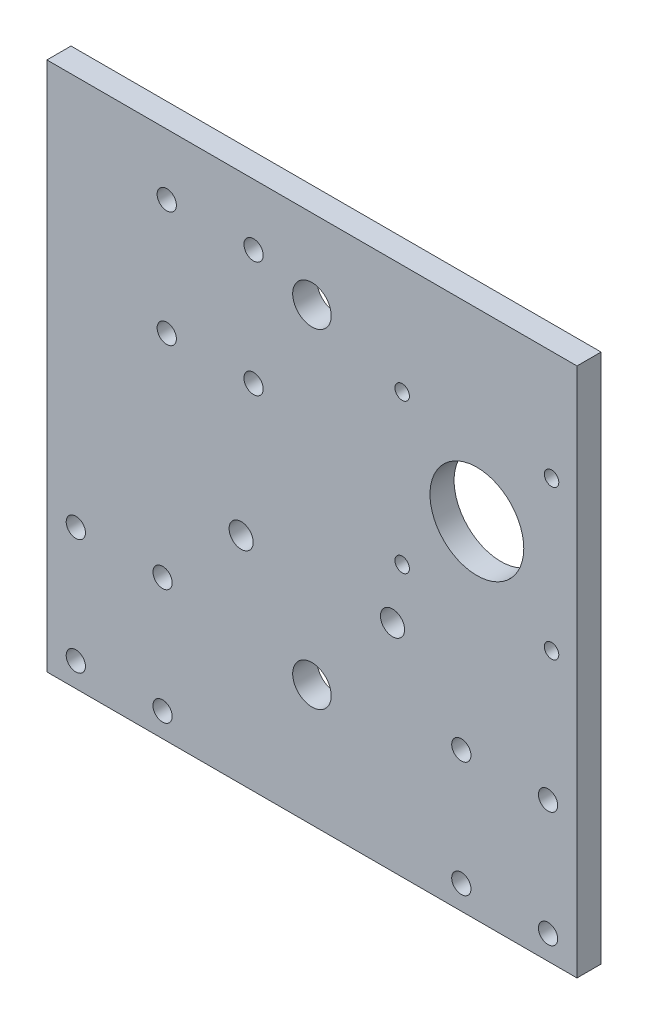
ISO-10303-21;
HEADER;
FILE_DESCRIPTION(('STEP AP214'),'2;1');
FILE_NAME('part.step','',(''),(''),'','','');
FILE_SCHEMA(('AUTOMOTIVE_DESIGN { 1 0 10303 214 1 1 1 1 }'));
ENDSEC;
DATA;
#1=APPLICATION_CONTEXT('core data for automotive mechanical design processes');
#2=APPLICATION_PROTOCOL_DEFINITION('international standard','automotive_design',2000,#1);
#3=PRODUCT_CONTEXT('',#1,'mechanical');
#4=PRODUCT('Part','Part','',(#3));
#5=PRODUCT_RELATED_PRODUCT_CATEGORY('part','',(#4));
#6=PRODUCT_DEFINITION_FORMATION('','',#4);
#7=PRODUCT_DEFINITION_CONTEXT('part definition',#1,'design');
#8=PRODUCT_DEFINITION('design','',#6,#7);
#9=PRODUCT_DEFINITION_SHAPE('','',#8);
#10=(LENGTH_UNIT() NAMED_UNIT(*) SI_UNIT(.MILLI.,.METRE.));
#11=(NAMED_UNIT(*) PLANE_ANGLE_UNIT() SI_UNIT($,.RADIAN.));
#12=(NAMED_UNIT(*) SI_UNIT($,.STERADIAN.) SOLID_ANGLE_UNIT());
#13=UNCERTAINTY_MEASURE_WITH_UNIT(LENGTH_MEASURE(1.E-05),#10,'distance_accuracy_value','');
#14=(GEOMETRIC_REPRESENTATION_CONTEXT(3) GLOBAL_UNCERTAINTY_ASSIGNED_CONTEXT((#13)) GLOBAL_UNIT_ASSIGNED_CONTEXT((#10,
#11,#12)) REPRESENTATION_CONTEXT('',''));
#15=CARTESIAN_POINT('',(0.,0.,0.));
#16=DIRECTION('',(0.,0.,1.));
#17=DIRECTION('',(1.,0.,0.));
#18=AXIS2_PLACEMENT_3D('',#15,#16,#17);
#19=CARTESIAN_POINT('',(0.,0.,5.));
#20=DIRECTION('',(0.,0.,1.));
#21=DIRECTION('',(1.,0.,0.));
#22=AXIS2_PLACEMENT_3D('',#19,#20,#21);
#23=PLANE('',#22);
#24=CARTESIAN_POINT('',(-12.1170545369142,10.9400694331961,5.));
#25=DIRECTION('',(0.,0.,1.));
#26=DIRECTION('',(1.,0.,0.));
#27=AXIS2_PLACEMENT_3D('',#24,#25,#26);
#28=CIRCLE('',#27,2.00000000000001);
#29=CARTESIAN_POINT('',(-10.1170545369142,10.9400694331961,5.));
#30=VERTEX_POINT('',#29);
#31=EDGE_CURVE('E223',#30,#30,#28,.T.);
#32=ORIENTED_EDGE('',*,*,#31,.F.);
#33=EDGE_LOOP('',(#32));
#34=FACE_BOUND('',#33,.T.);
#35=CARTESIAN_POINT('',(-30.130204967949,34.9576033412424,5.));
#36=DIRECTION('',(0.,0.,1.));
#37=DIRECTION('',(1.,0.,0.));
#38=AXIS2_PLACEMENT_3D('',#35,#36,#37);
#39=CIRCLE('',#38,2.);
#40=CARTESIAN_POINT('',(-28.130204967949,34.9576033412424,5.));
#41=VERTEX_POINT('',#40);
#42=EDGE_CURVE('E211',#41,#41,#39,.T.);
#43=ORIENTED_EDGE('',*,*,#42,.F.);
#44=EDGE_LOOP('',(#43));
#45=FACE_BOUND('',#44,.T.);
#46=CARTESIAN_POINT('',(-14.6929836231473,-17.6563688298987,5.));
#47=DIRECTION('',(0.,0.,1.));
#48=DIRECTION('',(1.,0.,0.));
#49=AXIS2_PLACEMENT_3D('',#46,#47,#48);
#50=CIRCLE('',#49,2.5);
#51=CARTESIAN_POINT('',(-12.1929836231473,-17.6563688298987,5.));
#52=VERTEX_POINT('',#51);
#53=EDGE_CURVE('E199',#52,#52,#50,.T.);
#54=ORIENTED_EDGE('',*,*,#53,.F.);
#55=EDGE_LOOP('',(#54));
#56=FACE_BOUND('',#55,.T.);
#57=CARTESIAN_POINT('',(0.,31.1488363872192,5.));
#58=DIRECTION('',(0.,0.,1.));
#59=DIRECTION('',(1.,0.,0.));
#60=AXIS2_PLACEMENT_3D('',#57,#58,#59);
#61=CIRCLE('',#60,4.00000000000001);
#62=CARTESIAN_POINT('',(4.00000000000001,31.1488363872192,5.));
#63=VERTEX_POINT('',#62);
#64=EDGE_CURVE('E187',#63,#63,#61,.T.);
#65=ORIENTED_EDGE('',*,*,#64,.F.);
#66=EDGE_LOOP('',(#65));
#67=FACE_BOUND('',#66,.T.);
#68=CARTESIAN_POINT('',(18.7257473028765,-6.17122300485301,5.));
#69=DIRECTION('',(0.,0.,1.));
#70=DIRECTION('',(1.,0.,0.));
#71=AXIS2_PLACEMENT_3D('',#68,#69,#70);
#72=CIRCLE('',#71,1.5);
#73=CARTESIAN_POINT('',(20.2257473028765,-6.17122300485301,5.));
#74=VERTEX_POINT('',#73);
#75=EDGE_CURVE('E175',#74,#74,#72,.T.);
#76=ORIENTED_EDGE('',*,*,#75,.F.);
#77=EDGE_LOOP('',(#76));
#78=FACE_BOUND('',#77,.T.);
#79=CARTESIAN_POINT('',(49.7257473028764,24.828776995147,5.));
#80=DIRECTION('',(0.,0.,1.));
#81=DIRECTION('',(1.,0.,0.));
#82=AXIS2_PLACEMENT_3D('',#79,#80,#81);
#83=CIRCLE('',#82,1.50000000000002);
#84=CARTESIAN_POINT('',(51.2257473028765,24.828776995147,5.));
#85=VERTEX_POINT('',#84);
#86=EDGE_CURVE('E163',#85,#85,#83,.T.);
#87=ORIENTED_EDGE('',*,*,#86,.F.);
#88=EDGE_LOOP('',(#87));
#89=FACE_BOUND('',#88,.T.);
#90=CARTESIAN_POINT('',(49.,-57.3511636127808,5.));
#91=DIRECTION('',(0.,0.,1.));
#92=DIRECTION('',(1.,0.,0.));
#93=AXIS2_PLACEMENT_3D('',#90,#91,#92);
#94=CIRCLE('',#93,2.);
#95=CARTESIAN_POINT('',(51.,-57.3511636127808,5.));
#96=VERTEX_POINT('',#95);
#97=EDGE_CURVE('E151',#96,#96,#94,.T.);
#98=ORIENTED_EDGE('',*,*,#97,.F.);
#99=EDGE_LOOP('',(#98));
#100=FACE_BOUND('',#99,.T.);
#101=CARTESIAN_POINT('',(-31.,-57.3511636127808,5.));
#102=DIRECTION('',(0.,0.,1.));
#103=DIRECTION('',(1.,0.,0.));
#104=AXIS2_PLACEMENT_3D('',#101,#102,#103);
#105=CIRCLE('',#104,2.);
#106=CARTESIAN_POINT('',(-29.,-57.3511636127808,5.));
#107=VERTEX_POINT('',#106);
#108=EDGE_CURVE('E139',#107,#107,#105,.T.);
#109=ORIENTED_EDGE('',*,*,#108,.F.);
#110=EDGE_LOOP('',(#109));
#111=FACE_BOUND('',#110,.T.);
#112=CARTESIAN_POINT('',(-49.,-33.3511636127808,5.));
#113=DIRECTION('',(0.,0.,1.));
#114=DIRECTION('',(1.,0.,0.));
#115=AXIS2_PLACEMENT_3D('',#112,#113,#114);
#116=CIRCLE('',#115,2.);
#117=CARTESIAN_POINT('',(-47.,-33.3511636127808,5.));
#118=VERTEX_POINT('',#117);
#119=EDGE_CURVE('E127',#118,#118,#116,.T.);
#120=ORIENTED_EDGE('',*,*,#119,.F.);
#121=EDGE_LOOP('',(#120));
#122=FACE_BOUND('',#121,.T.);
#123=CARTESIAN_POINT('',(31.,-33.3511636127808,5.));
#124=DIRECTION('',(0.,0.,1.));
#125=DIRECTION('',(1.,0.,0.));
#126=AXIS2_PLACEMENT_3D('',#123,#124,#125);
#127=CIRCLE('',#126,2.);
#128=CARTESIAN_POINT('',(33.,-33.3511636127808,5.));
#129=VERTEX_POINT('',#128);
#130=EDGE_CURVE('E115',#129,#129,#127,.T.);
#131=ORIENTED_EDGE('',*,*,#130,.F.);
#132=EDGE_LOOP('',(#131));
#133=FACE_BOUND('',#132,.T.);
#134=DIRECTION('',(0.,1.,0.));
#135=VECTOR('',#134,1.);
#136=CARTESIAN_POINT('',(55.,47.6488363872192,5.));
#137=LINE('',#136,#135);
#138=CARTESIAN_POINT('',(55.,-62.3511636127808,5.));
#139=VERTEX_POINT('',#138);
#140=CARTESIAN_POINT('',(55.,47.6488363872192,5.));
#141=VERTEX_POINT('',#140);
#142=EDGE_CURVE('E85',#139,#141,#137,.T.);
#143=ORIENTED_EDGE('',*,*,#142,.T.);
#144=DIRECTION('',(-1.,0.,0.));
#145=VECTOR('',#144,1.);
#146=CARTESIAN_POINT('',(-55.,47.6488363872192,5.));
#147=LINE('',#146,#145);
#148=CARTESIAN_POINT('',(-55.,47.6488363872192,5.));
#149=VERTEX_POINT('',#148);
#150=EDGE_CURVE('E80',#141,#149,#147,.T.);
#151=ORIENTED_EDGE('',*,*,#150,.T.);
#152=DIRECTION('',(0.,-1.,0.));
#153=VECTOR('',#152,1.);
#154=CARTESIAN_POINT('',(-55.,47.6488363872192,5.));
#155=LINE('',#154,#153);
#156=CARTESIAN_POINT('',(-55.,-62.3511636127808,5.));
#157=VERTEX_POINT('',#156);
#158=EDGE_CURVE('E83',#149,#157,#155,.T.);
#159=ORIENTED_EDGE('',*,*,#158,.T.);
#160=DIRECTION('',(1.,0.,0.));
#161=VECTOR('',#160,1.);
#162=CARTESIAN_POINT('',(-55.,-62.3511636127808,5.));
#163=LINE('',#162,#161);
#164=EDGE_CURVE('E50',#157,#139,#163,.T.);
#165=ORIENTED_EDGE('',*,*,#164,.T.);
#166=EDGE_LOOP('',(#143,#151,#159,#165));
#167=FACE_BOUND('',#166,.T.);
#168=CARTESIAN_POINT('',(49.,-33.3511636127808,5.));
#169=DIRECTION('',(0.,0.,1.));
#170=DIRECTION('',(1.,0.,0.));
#171=AXIS2_PLACEMENT_3D('',#168,#169,#170);
#172=CIRCLE('',#171,2.);
#173=CARTESIAN_POINT('',(51.,-33.3511636127808,5.));
#174=VERTEX_POINT('',#173);
#175=EDGE_CURVE('E100',#174,#174,#172,.T.);
#176=ORIENTED_EDGE('',*,*,#175,.F.);
#177=EDGE_LOOP('',(#176));
#178=FACE_BOUND('',#177,.T.);
#179=CARTESIAN_POINT('',(-31.,-33.3511636127808,5.));
#180=DIRECTION('',(0.,0.,1.));
#181=DIRECTION('',(1.,0.,0.));
#182=AXIS2_PLACEMENT_3D('',#179,#180,#181);
#183=CIRCLE('',#182,2.);
#184=CARTESIAN_POINT('',(-29.,-33.3511636127808,5.));
#185=VERTEX_POINT('',#184);
#186=EDGE_CURVE('E121',#185,#185,#183,.T.);
#187=ORIENTED_EDGE('',*,*,#186,.F.);
#188=EDGE_LOOP('',(#187));
#189=FACE_BOUND('',#188,.T.);
#190=CARTESIAN_POINT('',(-49.,-57.3511636127808,5.));
#191=DIRECTION('',(0.,0.,1.));
#192=DIRECTION('',(1.,0.,0.));
#193=AXIS2_PLACEMENT_3D('',#190,#191,#192);
#194=CIRCLE('',#193,2.);
#195=CARTESIAN_POINT('',(-47.,-57.3511636127808,5.));
#196=VERTEX_POINT('',#195);
#197=EDGE_CURVE('E133',#196,#196,#194,.T.);
#198=ORIENTED_EDGE('',*,*,#197,.F.);
#199=EDGE_LOOP('',(#198));
#200=FACE_BOUND('',#199,.T.);
#201=CARTESIAN_POINT('',(31.,-57.3511636127808,5.));
#202=DIRECTION('',(0.,0.,1.));
#203=DIRECTION('',(1.,0.,0.));
#204=AXIS2_PLACEMENT_3D('',#201,#202,#203);
#205=CIRCLE('',#204,2.);
#206=CARTESIAN_POINT('',(33.,-57.3511636127808,5.));
#207=VERTEX_POINT('',#206);
#208=EDGE_CURVE('E145',#207,#207,#205,.T.);
#209=ORIENTED_EDGE('',*,*,#208,.F.);
#210=EDGE_LOOP('',(#209));
#211=FACE_BOUND('',#210,.T.);
#212=CARTESIAN_POINT('',(34.2257473028765,9.32877699514699,5.));
#213=DIRECTION('',(0.,0.,1.));
#214=DIRECTION('',(1.,0.,0.));
#215=AXIS2_PLACEMENT_3D('',#212,#213,#214);
#216=CIRCLE('',#215,9.73080513096991);
#217=CARTESIAN_POINT('',(43.9565524338464,9.32877699514699,5.));
#218=VERTEX_POINT('',#217);
#219=EDGE_CURVE('E157',#218,#218,#216,.T.);
#220=ORIENTED_EDGE('',*,*,#219,.F.);
#221=EDGE_LOOP('',(#220));
#222=FACE_BOUND('',#221,.T.);
#223=CARTESIAN_POINT('',(49.7257473028765,-6.17122300485301,5.));
#224=DIRECTION('',(0.,0.,1.));
#225=DIRECTION('',(1.,0.,0.));
#226=AXIS2_PLACEMENT_3D('',#223,#224,#225);
#227=CIRCLE('',#226,1.50000000000001);
#228=CARTESIAN_POINT('',(51.2257473028765,-6.17122300485301,5.));
#229=VERTEX_POINT('',#228);
#230=EDGE_CURVE('E169',#229,#229,#227,.T.);
#231=ORIENTED_EDGE('',*,*,#230,.F.);
#232=EDGE_LOOP('',(#231));
#233=FACE_BOUND('',#232,.T.);
#234=CARTESIAN_POINT('',(18.7257473028765,24.828776995147,5.));
#235=DIRECTION('',(0.,0.,1.));
#236=DIRECTION('',(1.,0.,0.));
#237=AXIS2_PLACEMENT_3D('',#234,#235,#236);
#238=CIRCLE('',#237,1.5);
#239=CARTESIAN_POINT('',(20.2257473028765,24.828776995147,5.));
#240=VERTEX_POINT('',#239);
#241=EDGE_CURVE('E181',#240,#240,#238,.T.);
#242=ORIENTED_EDGE('',*,*,#241,.F.);
#243=EDGE_LOOP('',(#242));
#244=FACE_BOUND('',#243,.T.);
#245=CARTESIAN_POINT('',(0.,-37.1511636127808,5.));
#246=DIRECTION('',(0.,0.,1.));
#247=DIRECTION('',(1.,0.,0.));
#248=AXIS2_PLACEMENT_3D('',#245,#246,#247);
#249=CIRCLE('',#248,4.);
#250=CARTESIAN_POINT('',(4.,-37.1511636127808,5.));
#251=VERTEX_POINT('',#250);
#252=EDGE_CURVE('E193',#251,#251,#249,.T.);
#253=ORIENTED_EDGE('',*,*,#252,.F.);
#254=EDGE_LOOP('',(#253));
#255=FACE_BOUND('',#254,.T.);
#256=CARTESIAN_POINT('',(-12.1170545369142,34.9576033412423,5.));
#257=DIRECTION('',(0.,0.,1.));
#258=DIRECTION('',(1.,0.,0.));
#259=AXIS2_PLACEMENT_3D('',#256,#257,#258);
#260=CIRCLE('',#259,2.00000000000001);
#261=CARTESIAN_POINT('',(-10.1170545369142,34.9576033412423,5.));
#262=VERTEX_POINT('',#261);
#263=EDGE_CURVE('E205',#262,#262,#260,.T.);
#264=ORIENTED_EDGE('',*,*,#263,.F.);
#265=EDGE_LOOP('',(#264));
#266=FACE_BOUND('',#265,.T.);
#267=CARTESIAN_POINT('',(-30.130204967949,10.9400694331961,5.));
#268=DIRECTION('',(0.,0.,1.));
#269=DIRECTION('',(1.,0.,0.));
#270=AXIS2_PLACEMENT_3D('',#267,#268,#269);
#271=CIRCLE('',#270,2.);
#272=CARTESIAN_POINT('',(-28.130204967949,10.9400694331961,5.));
#273=VERTEX_POINT('',#272);
#274=EDGE_CURVE('E217',#273,#273,#271,.T.);
#275=ORIENTED_EDGE('',*,*,#274,.F.);
#276=EDGE_LOOP('',(#275));
#277=FACE_BOUND('',#276,.T.);
#278=CARTESIAN_POINT('',(16.7206861045781,-17.6563688298987,5.));
#279=DIRECTION('',(0.,0.,1.));
#280=DIRECTION('',(1.,0.,0.));
#281=AXIS2_PLACEMENT_3D('',#278,#279,#280);
#282=CIRCLE('',#281,2.5);
#283=CARTESIAN_POINT('',(19.2206861045781,-17.6563688298987,5.));
#284=VERTEX_POINT('',#283);
#285=EDGE_CURVE('E229',#284,#284,#282,.T.);
#286=ORIENTED_EDGE('',*,*,#285,.F.);
#287=EDGE_LOOP('',(#286));
#288=FACE_BOUND('',#287,.T.);
#289=ADVANCED_FACE('F33',(#34,#45,#56,#67,#78,#89,#100,#111,#122,#133,#167,#178,#189,#200,#211,
#222,#233,#244,#255,#266,#277,#288),#23,.T.);
#290=CARTESIAN_POINT('',(0.,0.,0.));
#291=DIRECTION('',(0.,0.,1.));
#292=DIRECTION('',(1.,0.,0.));
#293=AXIS2_PLACEMENT_3D('',#290,#291,#292);
#294=PLANE('',#293);
#295=DIRECTION('',(0.,1.,0.));
#296=VECTOR('',#295,1.);
#297=CARTESIAN_POINT('',(55.,47.6488363872192,0.));
#298=LINE('',#297,#296);
#299=CARTESIAN_POINT('',(55.,-62.3511636127808,0.));
#300=VERTEX_POINT('',#299);
#301=CARTESIAN_POINT('',(55.,47.6488363872192,0.));
#302=VERTEX_POINT('',#301);
#303=EDGE_CURVE('E97',#300,#302,#298,.T.);
#304=ORIENTED_EDGE('',*,*,#303,.F.);
#305=DIRECTION('',(1.,0.,0.));
#306=VECTOR('',#305,1.);
#307=CARTESIAN_POINT('',(-55.,-62.3511636127808,0.));
#308=LINE('',#307,#306);
#309=CARTESIAN_POINT('',(-55.,-62.3511636127808,0.));
#310=VERTEX_POINT('',#309);
#311=EDGE_CURVE('E73',#310,#300,#308,.T.);
#312=ORIENTED_EDGE('',*,*,#311,.F.);
#313=DIRECTION('',(0.,-1.,0.));
#314=VECTOR('',#313,1.);
#315=CARTESIAN_POINT('',(-55.,47.6488363872192,0.));
#316=LINE('',#315,#314);
#317=CARTESIAN_POINT('',(-55.,47.6488363872192,0.));
#318=VERTEX_POINT('',#317);
#319=EDGE_CURVE('E67',#318,#310,#316,.T.);
#320=ORIENTED_EDGE('',*,*,#319,.F.);
#321=DIRECTION('',(-1.,0.,0.));
#322=VECTOR('',#321,1.);
#323=CARTESIAN_POINT('',(-55.,47.6488363872192,0.));
#324=LINE('',#323,#322);
#325=EDGE_CURVE('E89',#302,#318,#324,.T.);
#326=ORIENTED_EDGE('',*,*,#325,.F.);
#327=EDGE_LOOP('',(#304,#312,#320,#326));
#328=FACE_BOUND('',#327,.T.);
#329=CARTESIAN_POINT('',(49.,-33.3511636127808,0.));
#330=DIRECTION('',(0.,0.,1.));
#331=DIRECTION('',(1.,0.,0.));
#332=AXIS2_PLACEMENT_3D('',#329,#330,#331);
#333=CIRCLE('',#332,2.);
#334=CARTESIAN_POINT('',(51.,-33.3511636127808,0.));
#335=VERTEX_POINT('',#334);
#336=EDGE_CURVE('E112',#335,#335,#333,.T.);
#337=ORIENTED_EDGE('',*,*,#336,.T.);
#338=EDGE_LOOP('',(#337));
#339=FACE_BOUND('',#338,.T.);
#340=CARTESIAN_POINT('',(31.,-33.3511636127808,0.));
#341=DIRECTION('',(0.,0.,1.));
#342=DIRECTION('',(1.,0.,0.));
#343=AXIS2_PLACEMENT_3D('',#340,#341,#342);
#344=CIRCLE('',#343,2.);
#345=CARTESIAN_POINT('',(33.,-33.3511636127808,0.));
#346=VERTEX_POINT('',#345);
#347=EDGE_CURVE('E118',#346,#346,#344,.T.);
#348=ORIENTED_EDGE('',*,*,#347,.T.);
#349=EDGE_LOOP('',(#348));
#350=FACE_BOUND('',#349,.T.);
#351=CARTESIAN_POINT('',(-31.,-33.3511636127808,0.));
#352=DIRECTION('',(0.,0.,1.));
#353=DIRECTION('',(1.,0.,0.));
#354=AXIS2_PLACEMENT_3D('',#351,#352,#353);
#355=CIRCLE('',#354,2.);
#356=CARTESIAN_POINT('',(-29.,-33.3511636127808,0.));
#357=VERTEX_POINT('',#356);
#358=EDGE_CURVE('E124',#357,#357,#355,.T.);
#359=ORIENTED_EDGE('',*,*,#358,.T.);
#360=EDGE_LOOP('',(#359));
#361=FACE_BOUND('',#360,.T.);
#362=CARTESIAN_POINT('',(-49.,-33.3511636127808,0.));
#363=DIRECTION('',(0.,0.,1.));
#364=DIRECTION('',(1.,0.,0.));
#365=AXIS2_PLACEMENT_3D('',#362,#363,#364);
#366=CIRCLE('',#365,2.);
#367=CARTESIAN_POINT('',(-47.,-33.3511636127808,0.));
#368=VERTEX_POINT('',#367);
#369=EDGE_CURVE('E130',#368,#368,#366,.T.);
#370=ORIENTED_EDGE('',*,*,#369,.T.);
#371=EDGE_LOOP('',(#370));
#372=FACE_BOUND('',#371,.T.);
#373=CARTESIAN_POINT('',(-49.,-57.3511636127808,0.));
#374=DIRECTION('',(0.,0.,1.));
#375=DIRECTION('',(1.,0.,0.));
#376=AXIS2_PLACEMENT_3D('',#373,#374,#375);
#377=CIRCLE('',#376,2.);
#378=CARTESIAN_POINT('',(-47.,-57.3511636127808,0.));
#379=VERTEX_POINT('',#378);
#380=EDGE_CURVE('E136',#379,#379,#377,.T.);
#381=ORIENTED_EDGE('',*,*,#380,.T.);
#382=EDGE_LOOP('',(#381));
#383=FACE_BOUND('',#382,.T.);
#384=CARTESIAN_POINT('',(-31.,-57.3511636127808,0.));
#385=DIRECTION('',(0.,0.,1.));
#386=DIRECTION('',(1.,0.,0.));
#387=AXIS2_PLACEMENT_3D('',#384,#385,#386);
#388=CIRCLE('',#387,2.);
#389=CARTESIAN_POINT('',(-29.,-57.3511636127808,0.));
#390=VERTEX_POINT('',#389);
#391=EDGE_CURVE('E142',#390,#390,#388,.T.);
#392=ORIENTED_EDGE('',*,*,#391,.T.);
#393=EDGE_LOOP('',(#392));
#394=FACE_BOUND('',#393,.T.);
#395=CARTESIAN_POINT('',(31.,-57.3511636127808,0.));
#396=DIRECTION('',(0.,0.,1.));
#397=DIRECTION('',(1.,0.,0.));
#398=AXIS2_PLACEMENT_3D('',#395,#396,#397);
#399=CIRCLE('',#398,2.);
#400=CARTESIAN_POINT('',(33.,-57.3511636127808,0.));
#401=VERTEX_POINT('',#400);
#402=EDGE_CURVE('E148',#401,#401,#399,.T.);
#403=ORIENTED_EDGE('',*,*,#402,.T.);
#404=EDGE_LOOP('',(#403));
#405=FACE_BOUND('',#404,.T.);
#406=CARTESIAN_POINT('',(49.,-57.3511636127808,0.));
#407=DIRECTION('',(0.,0.,1.));
#408=DIRECTION('',(1.,0.,0.));
#409=AXIS2_PLACEMENT_3D('',#406,#407,#408);
#410=CIRCLE('',#409,2.);
#411=CARTESIAN_POINT('',(51.,-57.3511636127808,0.));
#412=VERTEX_POINT('',#411);
#413=EDGE_CURVE('E154',#412,#412,#410,.T.);
#414=ORIENTED_EDGE('',*,*,#413,.T.);
#415=EDGE_LOOP('',(#414));
#416=FACE_BOUND('',#415,.T.);
#417=CARTESIAN_POINT('',(34.2257473028765,9.32877699514699,0.));
#418=DIRECTION('',(0.,0.,1.));
#419=DIRECTION('',(1.,0.,0.));
#420=AXIS2_PLACEMENT_3D('',#417,#418,#419);
#421=CIRCLE('',#420,9.73080513096991);
#422=CARTESIAN_POINT('',(43.9565524338464,9.32877699514699,0.));
#423=VERTEX_POINT('',#422);
#424=EDGE_CURVE('E160',#423,#423,#421,.T.);
#425=ORIENTED_EDGE('',*,*,#424,.T.);
#426=EDGE_LOOP('',(#425));
#427=FACE_BOUND('',#426,.T.);
#428=CARTESIAN_POINT('',(49.7257473028764,24.828776995147,0.));
#429=DIRECTION('',(0.,0.,1.));
#430=DIRECTION('',(1.,0.,0.));
#431=AXIS2_PLACEMENT_3D('',#428,#429,#430);
#432=CIRCLE('',#431,1.50000000000002);
#433=CARTESIAN_POINT('',(51.2257473028765,24.828776995147,0.));
#434=VERTEX_POINT('',#433);
#435=EDGE_CURVE('E166',#434,#434,#432,.T.);
#436=ORIENTED_EDGE('',*,*,#435,.T.);
#437=EDGE_LOOP('',(#436));
#438=FACE_BOUND('',#437,.T.);
#439=CARTESIAN_POINT('',(49.7257473028765,-6.17122300485301,0.));
#440=DIRECTION('',(0.,0.,1.));
#441=DIRECTION('',(1.,0.,0.));
#442=AXIS2_PLACEMENT_3D('',#439,#440,#441);
#443=CIRCLE('',#442,1.50000000000001);
#444=CARTESIAN_POINT('',(51.2257473028765,-6.17122300485301,0.));
#445=VERTEX_POINT('',#444);
#446=EDGE_CURVE('E172',#445,#445,#443,.T.);
#447=ORIENTED_EDGE('',*,*,#446,.T.);
#448=EDGE_LOOP('',(#447));
#449=FACE_BOUND('',#448,.T.);
#450=CARTESIAN_POINT('',(18.7257473028765,-6.17122300485301,0.));
#451=DIRECTION('',(0.,0.,1.));
#452=DIRECTION('',(1.,0.,0.));
#453=AXIS2_PLACEMENT_3D('',#450,#451,#452);
#454=CIRCLE('',#453,1.5);
#455=CARTESIAN_POINT('',(20.2257473028765,-6.17122300485301,0.));
#456=VERTEX_POINT('',#455);
#457=EDGE_CURVE('E178',#456,#456,#454,.T.);
#458=ORIENTED_EDGE('',*,*,#457,.T.);
#459=EDGE_LOOP('',(#458));
#460=FACE_BOUND('',#459,.T.);
#461=CARTESIAN_POINT('',(18.7257473028765,24.828776995147,0.));
#462=DIRECTION('',(0.,0.,1.));
#463=DIRECTION('',(1.,0.,0.));
#464=AXIS2_PLACEMENT_3D('',#461,#462,#463);
#465=CIRCLE('',#464,1.5);
#466=CARTESIAN_POINT('',(20.2257473028765,24.828776995147,0.));
#467=VERTEX_POINT('',#466);
#468=EDGE_CURVE('E184',#467,#467,#465,.T.);
#469=ORIENTED_EDGE('',*,*,#468,.T.);
#470=EDGE_LOOP('',(#469));
#471=FACE_BOUND('',#470,.T.);
#472=CARTESIAN_POINT('',(0.,31.1488363872192,0.));
#473=DIRECTION('',(0.,0.,1.));
#474=DIRECTION('',(1.,0.,0.));
#475=AXIS2_PLACEMENT_3D('',#472,#473,#474);
#476=CIRCLE('',#475,4.00000000000001);
#477=CARTESIAN_POINT('',(4.00000000000001,31.1488363872192,0.));
#478=VERTEX_POINT('',#477);
#479=EDGE_CURVE('E190',#478,#478,#476,.T.);
#480=ORIENTED_EDGE('',*,*,#479,.T.);
#481=EDGE_LOOP('',(#480));
#482=FACE_BOUND('',#481,.T.);
#483=CARTESIAN_POINT('',(0.,-37.1511636127808,0.));
#484=DIRECTION('',(0.,0.,1.));
#485=DIRECTION('',(1.,0.,0.));
#486=AXIS2_PLACEMENT_3D('',#483,#484,#485);
#487=CIRCLE('',#486,4.);
#488=CARTESIAN_POINT('',(4.,-37.1511636127808,0.));
#489=VERTEX_POINT('',#488);
#490=EDGE_CURVE('E196',#489,#489,#487,.T.);
#491=ORIENTED_EDGE('',*,*,#490,.T.);
#492=EDGE_LOOP('',(#491));
#493=FACE_BOUND('',#492,.T.);
#494=CARTESIAN_POINT('',(-14.6929836231473,-17.6563688298987,0.));
#495=DIRECTION('',(0.,0.,1.));
#496=DIRECTION('',(1.,0.,0.));
#497=AXIS2_PLACEMENT_3D('',#494,#495,#496);
#498=CIRCLE('',#497,2.5);
#499=CARTESIAN_POINT('',(-12.1929836231473,-17.6563688298987,0.));
#500=VERTEX_POINT('',#499);
#501=EDGE_CURVE('E202',#500,#500,#498,.T.);
#502=ORIENTED_EDGE('',*,*,#501,.T.);
#503=EDGE_LOOP('',(#502));
#504=FACE_BOUND('',#503,.T.);
#505=CARTESIAN_POINT('',(-12.1170545369142,34.9576033412423,0.));
#506=DIRECTION('',(0.,0.,1.));
#507=DIRECTION('',(1.,0.,0.));
#508=AXIS2_PLACEMENT_3D('',#505,#506,#507);
#509=CIRCLE('',#508,2.00000000000001);
#510=CARTESIAN_POINT('',(-10.1170545369142,34.9576033412423,0.));
#511=VERTEX_POINT('',#510);
#512=EDGE_CURVE('E208',#511,#511,#509,.T.);
#513=ORIENTED_EDGE('',*,*,#512,.T.);
#514=EDGE_LOOP('',(#513));
#515=FACE_BOUND('',#514,.T.);
#516=CARTESIAN_POINT('',(-30.130204967949,34.9576033412424,0.));
#517=DIRECTION('',(0.,0.,1.));
#518=DIRECTION('',(1.,0.,0.));
#519=AXIS2_PLACEMENT_3D('',#516,#517,#518);
#520=CIRCLE('',#519,2.);
#521=CARTESIAN_POINT('',(-28.130204967949,34.9576033412424,0.));
#522=VERTEX_POINT('',#521);
#523=EDGE_CURVE('E214',#522,#522,#520,.T.);
#524=ORIENTED_EDGE('',*,*,#523,.T.);
#525=EDGE_LOOP('',(#524));
#526=FACE_BOUND('',#525,.T.);
#527=CARTESIAN_POINT('',(-30.130204967949,10.9400694331961,0.));
#528=DIRECTION('',(0.,0.,1.));
#529=DIRECTION('',(1.,0.,0.));
#530=AXIS2_PLACEMENT_3D('',#527,#528,#529);
#531=CIRCLE('',#530,2.);
#532=CARTESIAN_POINT('',(-28.130204967949,10.9400694331961,0.));
#533=VERTEX_POINT('',#532);
#534=EDGE_CURVE('E220',#533,#533,#531,.T.);
#535=ORIENTED_EDGE('',*,*,#534,.T.);
#536=EDGE_LOOP('',(#535));
#537=FACE_BOUND('',#536,.T.);
#538=CARTESIAN_POINT('',(-12.1170545369142,10.9400694331961,0.));
#539=DIRECTION('',(0.,0.,1.));
#540=DIRECTION('',(1.,0.,0.));
#541=AXIS2_PLACEMENT_3D('',#538,#539,#540);
#542=CIRCLE('',#541,2.00000000000001);
#543=CARTESIAN_POINT('',(-10.1170545369142,10.9400694331961,0.));
#544=VERTEX_POINT('',#543);
#545=EDGE_CURVE('E226',#544,#544,#542,.T.);
#546=ORIENTED_EDGE('',*,*,#545,.T.);
#547=EDGE_LOOP('',(#546));
#548=FACE_BOUND('',#547,.T.);
#549=CARTESIAN_POINT('',(16.7206861045781,-17.6563688298987,0.));
#550=DIRECTION('',(0.,0.,1.));
#551=DIRECTION('',(1.,0.,0.));
#552=AXIS2_PLACEMENT_3D('',#549,#550,#551);
#553=CIRCLE('',#552,2.5);
#554=CARTESIAN_POINT('',(19.2206861045781,-17.6563688298987,0.));
#555=VERTEX_POINT('',#554);
#556=EDGE_CURVE('E232',#555,#555,#553,.T.);
#557=ORIENTED_EDGE('',*,*,#556,.T.);
#558=EDGE_LOOP('',(#557));
#559=FACE_BOUND('',#558,.T.);
#560=ADVANCED_FACE('F108',(#328,#339,#350,#361,#372,#383,#394,#405,#416,#427,#438,#449,#460,
#471,#482,#493,#504,#515,#526,#537,#548,#559),#294,.F.);
#561=CARTESIAN_POINT('',(55.,47.6488363872192,5.));
#562=DIRECTION('',(-1.,0.,0.));
#563=DIRECTION('',(0.,-1.,0.));
#564=AXIS2_PLACEMENT_3D('',#561,#562,#563);
#565=PLANE('',#564);
#566=ORIENTED_EDGE('',*,*,#303,.T.);
#567=DIRECTION('',(0.,0.,-1.));
#568=VECTOR('',#567,1.);
#569=CARTESIAN_POINT('',(55.,47.6488363872192,5.));
#570=LINE('',#569,#568);
#571=EDGE_CURVE('E11',#141,#302,#570,.T.);
#572=ORIENTED_EDGE('',*,*,#571,.F.);
#573=ORIENTED_EDGE('',*,*,#142,.F.);
#574=DIRECTION('',(0.,0.,-1.));
#575=VECTOR('',#574,1.);
#576=CARTESIAN_POINT('',(55.,-62.3511636127808,5.));
#577=LINE('',#576,#575);
#578=EDGE_CURVE('E93',#139,#300,#577,.T.);
#579=ORIENTED_EDGE('',*,*,#578,.T.);
#580=EDGE_LOOP('',(#566,#572,#573,#579));
#581=FACE_BOUND('',#580,.T.);
#582=ADVANCED_FACE('F35',(#581),#565,.F.);
#583=CARTESIAN_POINT('',(-55.,47.6488363872192,5.));
#584=DIRECTION('',(0.,-1.,0.));
#585=DIRECTION('',(0.,0.,-1.));
#586=AXIS2_PLACEMENT_3D('',#583,#584,#585);
#587=PLANE('',#586);
#588=ORIENTED_EDGE('',*,*,#325,.T.);
#589=DIRECTION('',(0.,0.,-1.));
#590=VECTOR('',#589,1.);
#591=CARTESIAN_POINT('',(-55.,47.6488363872192,5.));
#592=LINE('',#591,#590);
#593=EDGE_CURVE('E42',#149,#318,#592,.T.);
#594=ORIENTED_EDGE('',*,*,#593,.F.);
#595=ORIENTED_EDGE('',*,*,#150,.F.);
#596=ORIENTED_EDGE('',*,*,#571,.T.);
#597=EDGE_LOOP('',(#588,#594,#595,#596));
#598=FACE_BOUND('',#597,.T.);
#599=ADVANCED_FACE('F88',(#598),#587,.F.);
#600=CARTESIAN_POINT('',(-55.,47.6488363872192,5.));
#601=DIRECTION('',(1.,0.,0.));
#602=DIRECTION('',(0.,1.,0.));
#603=AXIS2_PLACEMENT_3D('',#600,#601,#602);
#604=PLANE('',#603);
#605=ORIENTED_EDGE('',*,*,#319,.T.);
#606=DIRECTION('',(0.,0.,-1.));
#607=VECTOR('',#606,1.);
#608=CARTESIAN_POINT('',(-55.,-62.3511636127808,5.));
#609=LINE('',#608,#607);
#610=EDGE_CURVE('E90',#157,#310,#609,.T.);
#611=ORIENTED_EDGE('',*,*,#610,.F.);
#612=ORIENTED_EDGE('',*,*,#158,.F.);
#613=ORIENTED_EDGE('',*,*,#593,.T.);
#614=EDGE_LOOP('',(#605,#611,#612,#613));
#615=FACE_BOUND('',#614,.T.);
#616=ADVANCED_FACE('F91',(#615),#604,.F.);
#617=CARTESIAN_POINT('',(-55.,-62.3511636127808,5.));
#618=DIRECTION('',(0.,1.,0.));
#619=DIRECTION('',(0.,0.,1.));
#620=AXIS2_PLACEMENT_3D('',#617,#618,#619);
#621=PLANE('',#620);
#622=ORIENTED_EDGE('',*,*,#311,.T.);
#623=ORIENTED_EDGE('',*,*,#578,.F.);
#624=ORIENTED_EDGE('',*,*,#164,.F.);
#625=ORIENTED_EDGE('',*,*,#610,.T.);
#626=EDGE_LOOP('',(#622,#623,#624,#625));
#627=FACE_BOUND('',#626,.T.);
#628=ADVANCED_FACE('F105',(#627),#621,.F.);
#629=CARTESIAN_POINT('',(49.,-33.3511636127808,5.));
#630=DIRECTION('',(0.,0.,-1.));
#631=DIRECTION('',(-1.,0.,0.));
#632=AXIS2_PLACEMENT_3D('',#629,#630,#631);
#633=CYLINDRICAL_SURFACE('',#632,2.);
#634=ORIENTED_EDGE('',*,*,#175,.T.);
#635=EDGE_LOOP('',(#634));
#636=FACE_BOUND('',#635,.T.);
#637=ORIENTED_EDGE('',*,*,#336,.F.);
#638=EDGE_LOOP('',(#637));
#639=FACE_BOUND('',#638,.T.);
#640=ADVANCED_FACE('F251',(#636,#639),#633,.F.);
#641=CARTESIAN_POINT('',(31.,-33.3511636127808,5.));
#642=DIRECTION('',(0.,0.,-1.));
#643=DIRECTION('',(-1.,0.,0.));
#644=AXIS2_PLACEMENT_3D('',#641,#642,#643);
#645=CYLINDRICAL_SURFACE('',#644,2.);
#646=ORIENTED_EDGE('',*,*,#130,.T.);
#647=EDGE_LOOP('',(#646));
#648=FACE_BOUND('',#647,.T.);
#649=ORIENTED_EDGE('',*,*,#347,.F.);
#650=EDGE_LOOP('',(#649));
#651=FACE_BOUND('',#650,.T.);
#652=ADVANCED_FACE('F297',(#648,#651),#645,.F.);
#653=CARTESIAN_POINT('',(-31.,-33.3511636127808,5.));
#654=DIRECTION('',(0.,0.,-1.));
#655=DIRECTION('',(-1.,0.,0.));
#656=AXIS2_PLACEMENT_3D('',#653,#654,#655);
#657=CYLINDRICAL_SURFACE('',#656,2.);
#658=ORIENTED_EDGE('',*,*,#186,.T.);
#659=EDGE_LOOP('',(#658));
#660=FACE_BOUND('',#659,.T.);
#661=ORIENTED_EDGE('',*,*,#358,.F.);
#662=EDGE_LOOP('',(#661));
#663=FACE_BOUND('',#662,.T.);
#664=ADVANCED_FACE('F305',(#660,#663),#657,.F.);
#665=CARTESIAN_POINT('',(-49.,-33.3511636127808,5.));
#666=DIRECTION('',(0.,0.,-1.));
#667=DIRECTION('',(-1.,0.,0.));
#668=AXIS2_PLACEMENT_3D('',#665,#666,#667);
#669=CYLINDRICAL_SURFACE('',#668,2.);
#670=ORIENTED_EDGE('',*,*,#119,.T.);
#671=EDGE_LOOP('',(#670));
#672=FACE_BOUND('',#671,.T.);
#673=ORIENTED_EDGE('',*,*,#369,.F.);
#674=EDGE_LOOP('',(#673));
#675=FACE_BOUND('',#674,.T.);
#676=ADVANCED_FACE('F313',(#672,#675),#669,.F.);
#677=CARTESIAN_POINT('',(-49.,-57.3511636127808,5.));
#678=DIRECTION('',(0.,0.,-1.));
#679=DIRECTION('',(-1.,0.,0.));
#680=AXIS2_PLACEMENT_3D('',#677,#678,#679);
#681=CYLINDRICAL_SURFACE('',#680,2.);
#682=ORIENTED_EDGE('',*,*,#197,.T.);
#683=EDGE_LOOP('',(#682));
#684=FACE_BOUND('',#683,.T.);
#685=ORIENTED_EDGE('',*,*,#380,.F.);
#686=EDGE_LOOP('',(#685));
#687=FACE_BOUND('',#686,.T.);
#688=ADVANCED_FACE('F322',(#684,#687),#681,.F.);
#689=CARTESIAN_POINT('',(-31.,-57.3511636127808,5.));
#690=DIRECTION('',(0.,0.,-1.));
#691=DIRECTION('',(-1.,0.,0.));
#692=AXIS2_PLACEMENT_3D('',#689,#690,#691);
#693=CYLINDRICAL_SURFACE('',#692,2.);
#694=ORIENTED_EDGE('',*,*,#108,.T.);
#695=EDGE_LOOP('',(#694));
#696=FACE_BOUND('',#695,.T.);
#697=ORIENTED_EDGE('',*,*,#391,.F.);
#698=EDGE_LOOP('',(#697));
#699=FACE_BOUND('',#698,.T.);
#700=ADVANCED_FACE('F331',(#696,#699),#693,.F.);
#701=CARTESIAN_POINT('',(31.,-57.3511636127808,5.));
#702=DIRECTION('',(0.,0.,-1.));
#703=DIRECTION('',(-1.,0.,0.));
#704=AXIS2_PLACEMENT_3D('',#701,#702,#703);
#705=CYLINDRICAL_SURFACE('',#704,2.);
#706=ORIENTED_EDGE('',*,*,#208,.T.);
#707=EDGE_LOOP('',(#706));
#708=FACE_BOUND('',#707,.T.);
#709=ORIENTED_EDGE('',*,*,#402,.F.);
#710=EDGE_LOOP('',(#709));
#711=FACE_BOUND('',#710,.T.);
#712=ADVANCED_FACE('F340',(#708,#711),#705,.F.);
#713=CARTESIAN_POINT('',(49.,-57.3511636127808,5.));
#714=DIRECTION('',(0.,0.,-1.));
#715=DIRECTION('',(-1.,0.,0.));
#716=AXIS2_PLACEMENT_3D('',#713,#714,#715);
#717=CYLINDRICAL_SURFACE('',#716,2.);
#718=ORIENTED_EDGE('',*,*,#97,.T.);
#719=EDGE_LOOP('',(#718));
#720=FACE_BOUND('',#719,.T.);
#721=ORIENTED_EDGE('',*,*,#413,.F.);
#722=EDGE_LOOP('',(#721));
#723=FACE_BOUND('',#722,.T.);
#724=ADVANCED_FACE('F349',(#720,#723),#717,.F.);
#725=CARTESIAN_POINT('',(34.2257473028765,9.32877699514699,5.));
#726=DIRECTION('',(0.,0.,-1.));
#727=DIRECTION('',(-1.,0.,0.));
#728=AXIS2_PLACEMENT_3D('',#725,#726,#727);
#729=CYLINDRICAL_SURFACE('',#728,9.73080513096991);
#730=ORIENTED_EDGE('',*,*,#219,.T.);
#731=EDGE_LOOP('',(#730));
#732=FACE_BOUND('',#731,.T.);
#733=ORIENTED_EDGE('',*,*,#424,.F.);
#734=EDGE_LOOP('',(#733));
#735=FACE_BOUND('',#734,.T.);
#736=ADVANCED_FACE('F358',(#732,#735),#729,.F.);
#737=CARTESIAN_POINT('',(49.7257473028764,24.828776995147,5.));
#738=DIRECTION('',(0.,0.,-1.));
#739=DIRECTION('',(-1.,0.,0.));
#740=AXIS2_PLACEMENT_3D('',#737,#738,#739);
#741=CYLINDRICAL_SURFACE('',#740,1.50000000000002);
#742=ORIENTED_EDGE('',*,*,#86,.T.);
#743=EDGE_LOOP('',(#742));
#744=FACE_BOUND('',#743,.T.);
#745=ORIENTED_EDGE('',*,*,#435,.F.);
#746=EDGE_LOOP('',(#745));
#747=FACE_BOUND('',#746,.T.);
#748=ADVANCED_FACE('F367',(#744,#747),#741,.F.);
#749=CARTESIAN_POINT('',(49.7257473028765,-6.17122300485301,5.));
#750=DIRECTION('',(0.,0.,-1.));
#751=DIRECTION('',(-1.,0.,0.));
#752=AXIS2_PLACEMENT_3D('',#749,#750,#751);
#753=CYLINDRICAL_SURFACE('',#752,1.50000000000001);
#754=ORIENTED_EDGE('',*,*,#230,.T.);
#755=EDGE_LOOP('',(#754));
#756=FACE_BOUND('',#755,.T.);
#757=ORIENTED_EDGE('',*,*,#446,.F.);
#758=EDGE_LOOP('',(#757));
#759=FACE_BOUND('',#758,.T.);
#760=ADVANCED_FACE('F376',(#756,#759),#753,.F.);
#761=CARTESIAN_POINT('',(18.7257473028765,-6.17122300485301,5.));
#762=DIRECTION('',(0.,0.,-1.));
#763=DIRECTION('',(-1.,0.,0.));
#764=AXIS2_PLACEMENT_3D('',#761,#762,#763);
#765=CYLINDRICAL_SURFACE('',#764,1.5);
#766=ORIENTED_EDGE('',*,*,#75,.T.);
#767=EDGE_LOOP('',(#766));
#768=FACE_BOUND('',#767,.T.);
#769=ORIENTED_EDGE('',*,*,#457,.F.);
#770=EDGE_LOOP('',(#769));
#771=FACE_BOUND('',#770,.T.);
#772=ADVANCED_FACE('F385',(#768,#771),#765,.F.);
#773=CARTESIAN_POINT('',(18.7257473028765,24.828776995147,5.));
#774=DIRECTION('',(0.,0.,-1.));
#775=DIRECTION('',(-1.,0.,0.));
#776=AXIS2_PLACEMENT_3D('',#773,#774,#775);
#777=CYLINDRICAL_SURFACE('',#776,1.5);
#778=ORIENTED_EDGE('',*,*,#241,.T.);
#779=EDGE_LOOP('',(#778));
#780=FACE_BOUND('',#779,.T.);
#781=ORIENTED_EDGE('',*,*,#468,.F.);
#782=EDGE_LOOP('',(#781));
#783=FACE_BOUND('',#782,.T.);
#784=ADVANCED_FACE('F394',(#780,#783),#777,.F.);
#785=CARTESIAN_POINT('',(0.,31.1488363872192,5.));
#786=DIRECTION('',(0.,0.,-1.));
#787=DIRECTION('',(-1.,0.,0.));
#788=AXIS2_PLACEMENT_3D('',#785,#786,#787);
#789=CYLINDRICAL_SURFACE('',#788,4.00000000000001);
#790=ORIENTED_EDGE('',*,*,#64,.T.);
#791=EDGE_LOOP('',(#790));
#792=FACE_BOUND('',#791,.T.);
#793=ORIENTED_EDGE('',*,*,#479,.F.);
#794=EDGE_LOOP('',(#793));
#795=FACE_BOUND('',#794,.T.);
#796=ADVANCED_FACE('F403',(#792,#795),#789,.F.);
#797=CARTESIAN_POINT('',(0.,-37.1511636127808,5.));
#798=DIRECTION('',(0.,0.,-1.));
#799=DIRECTION('',(-1.,0.,0.));
#800=AXIS2_PLACEMENT_3D('',#797,#798,#799);
#801=CYLINDRICAL_SURFACE('',#800,4.);
#802=ORIENTED_EDGE('',*,*,#252,.T.);
#803=EDGE_LOOP('',(#802));
#804=FACE_BOUND('',#803,.T.);
#805=ORIENTED_EDGE('',*,*,#490,.F.);
#806=EDGE_LOOP('',(#805));
#807=FACE_BOUND('',#806,.T.);
#808=ADVANCED_FACE('F412',(#804,#807),#801,.F.);
#809=CARTESIAN_POINT('',(-14.6929836231473,-17.6563688298987,5.));
#810=DIRECTION('',(0.,0.,-1.));
#811=DIRECTION('',(-1.,0.,0.));
#812=AXIS2_PLACEMENT_3D('',#809,#810,#811);
#813=CYLINDRICAL_SURFACE('',#812,2.5);
#814=ORIENTED_EDGE('',*,*,#53,.T.);
#815=EDGE_LOOP('',(#814));
#816=FACE_BOUND('',#815,.T.);
#817=ORIENTED_EDGE('',*,*,#501,.F.);
#818=EDGE_LOOP('',(#817));
#819=FACE_BOUND('',#818,.T.);
#820=ADVANCED_FACE('F421',(#816,#819),#813,.F.);
#821=CARTESIAN_POINT('',(-12.1170545369142,34.9576033412423,5.));
#822=DIRECTION('',(0.,0.,-1.));
#823=DIRECTION('',(-1.,0.,0.));
#824=AXIS2_PLACEMENT_3D('',#821,#822,#823);
#825=CYLINDRICAL_SURFACE('',#824,2.00000000000001);
#826=ORIENTED_EDGE('',*,*,#263,.T.);
#827=EDGE_LOOP('',(#826));
#828=FACE_BOUND('',#827,.T.);
#829=ORIENTED_EDGE('',*,*,#512,.F.);
#830=EDGE_LOOP('',(#829));
#831=FACE_BOUND('',#830,.T.);
#832=ADVANCED_FACE('F430',(#828,#831),#825,.F.);
#833=CARTESIAN_POINT('',(-30.130204967949,34.9576033412424,5.));
#834=DIRECTION('',(0.,0.,-1.));
#835=DIRECTION('',(-1.,0.,0.));
#836=AXIS2_PLACEMENT_3D('',#833,#834,#835);
#837=CYLINDRICAL_SURFACE('',#836,2.);
#838=ORIENTED_EDGE('',*,*,#42,.T.);
#839=EDGE_LOOP('',(#838));
#840=FACE_BOUND('',#839,.T.);
#841=ORIENTED_EDGE('',*,*,#523,.F.);
#842=EDGE_LOOP('',(#841));
#843=FACE_BOUND('',#842,.T.);
#844=ADVANCED_FACE('F439',(#840,#843),#837,.F.);
#845=CARTESIAN_POINT('',(-30.130204967949,10.9400694331961,5.));
#846=DIRECTION('',(0.,0.,-1.));
#847=DIRECTION('',(-1.,0.,0.));
#848=AXIS2_PLACEMENT_3D('',#845,#846,#847);
#849=CYLINDRICAL_SURFACE('',#848,2.);
#850=ORIENTED_EDGE('',*,*,#274,.T.);
#851=EDGE_LOOP('',(#850));
#852=FACE_BOUND('',#851,.T.);
#853=ORIENTED_EDGE('',*,*,#534,.F.);
#854=EDGE_LOOP('',(#853));
#855=FACE_BOUND('',#854,.T.);
#856=ADVANCED_FACE('F448',(#852,#855),#849,.F.);
#857=CARTESIAN_POINT('',(-12.1170545369142,10.9400694331961,5.));
#858=DIRECTION('',(0.,0.,-1.));
#859=DIRECTION('',(-1.,0.,0.));
#860=AXIS2_PLACEMENT_3D('',#857,#858,#859);
#861=CYLINDRICAL_SURFACE('',#860,2.00000000000001);
#862=ORIENTED_EDGE('',*,*,#31,.T.);
#863=EDGE_LOOP('',(#862));
#864=FACE_BOUND('',#863,.T.);
#865=ORIENTED_EDGE('',*,*,#545,.F.);
#866=EDGE_LOOP('',(#865));
#867=FACE_BOUND('',#866,.T.);
#868=ADVANCED_FACE('F457',(#864,#867),#861,.F.);
#869=CARTESIAN_POINT('',(16.7206861045781,-17.6563688298987,5.));
#870=DIRECTION('',(0.,0.,-1.));
#871=DIRECTION('',(-1.,0.,0.));
#872=AXIS2_PLACEMENT_3D('',#869,#870,#871);
#873=CYLINDRICAL_SURFACE('',#872,2.5);
#874=ORIENTED_EDGE('',*,*,#285,.T.);
#875=EDGE_LOOP('',(#874));
#876=FACE_BOUND('',#875,.T.);
#877=ORIENTED_EDGE('',*,*,#556,.F.);
#878=EDGE_LOOP('',(#877));
#879=FACE_BOUND('',#878,.T.);
#880=ADVANCED_FACE('F238',(#876,#879),#873,.F.);
#881=CLOSED_SHELL('',(#289,#560,#582,#599,#616,#628,#640,#652,#664,#676,#688,#700,#712,#724,
#736,#748,#760,#772,#784,#796,#808,#820,#832,#844,#856,#868,#880));
#882=MANIFOLD_SOLID_BREP('B2',#881);
#883=ADVANCED_BREP_SHAPE_REPRESENTATION('',(#18,#882),#14);
#884=SHAPE_DEFINITION_REPRESENTATION(#9,#883);
ENDSEC;
END-ISO-10303-21;
